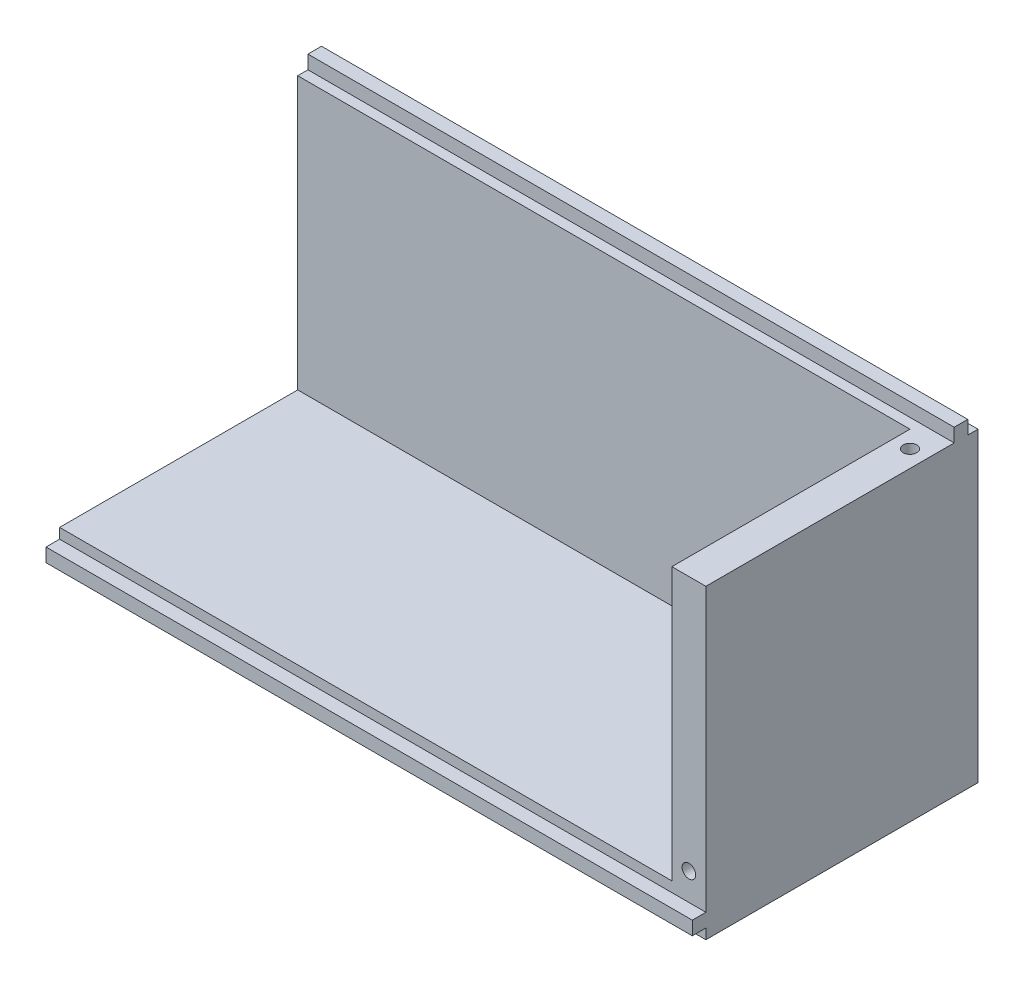
ISO-10303-21;
HEADER;
FILE_DESCRIPTION(('STEP AP214'),'2;1');
FILE_NAME('part.step','',(''),(''),'','','');
FILE_SCHEMA(('AUTOMOTIVE_DESIGN { 1 0 10303 214 1 1 1 1 }'));
ENDSEC;
DATA;
#1=APPLICATION_CONTEXT('core data for automotive mechanical design processes');
#2=APPLICATION_PROTOCOL_DEFINITION('international standard','automotive_design',2000,#1);
#3=PRODUCT_CONTEXT('',#1,'mechanical');
#4=PRODUCT('Part','Part','',(#3));
#5=PRODUCT_RELATED_PRODUCT_CATEGORY('part','',(#4));
#6=PRODUCT_DEFINITION_FORMATION('','',#4);
#7=PRODUCT_DEFINITION_CONTEXT('part definition',#1,'design');
#8=PRODUCT_DEFINITION('design','',#6,#7);
#9=PRODUCT_DEFINITION_SHAPE('','',#8);
#10=(LENGTH_UNIT() NAMED_UNIT(*) SI_UNIT(.MILLI.,.METRE.));
#11=(NAMED_UNIT(*) PLANE_ANGLE_UNIT() SI_UNIT($,.RADIAN.));
#12=(NAMED_UNIT(*) SI_UNIT($,.STERADIAN.) SOLID_ANGLE_UNIT());
#13=UNCERTAINTY_MEASURE_WITH_UNIT(LENGTH_MEASURE(1.E-05),#10,'distance_accuracy_value','');
#14=(GEOMETRIC_REPRESENTATION_CONTEXT(3) GLOBAL_UNCERTAINTY_ASSIGNED_CONTEXT((#13)) GLOBAL_UNIT_ASSIGNED_CONTEXT((#10,
#11,#12)) REPRESENTATION_CONTEXT('',''));
#15=CARTESIAN_POINT('',(0.,0.,0.));
#16=DIRECTION('',(0.,0.,1.));
#17=DIRECTION('',(1.,0.,0.));
#18=AXIS2_PLACEMENT_3D('',#15,#16,#17);
#19=CARTESIAN_POINT('',(0.,5.,0.));
#20=DIRECTION('',(0.,0.,-1.));
#21=DIRECTION('',(-1.,0.,0.));
#22=AXIS2_PLACEMENT_3D('',#19,#20,#21);
#23=PLANE('',#22);
#24=CARTESIAN_POINT('',(92.5,7.5,0.));
#25=DIRECTION('',(0.,0.,1.));
#26=DIRECTION('',(1.,0.,0.));
#27=AXIS2_PLACEMENT_3D('',#24,#25,#26);
#28=CIRCLE('',#27,0.999999999999987);
#29=CARTESIAN_POINT('',(93.5,7.5,0.));
#30=VERTEX_POINT('',#29);
#31=EDGE_CURVE('E167',#30,#30,#28,.T.);
#32=ORIENTED_EDGE('',*,*,#31,.F.);
#33=EDGE_LOOP('',(#32));
#34=FACE_BOUND('',#33,.T.);
#35=DIRECTION('',(-1.,0.,0.));
#36=VECTOR('',#35,1.);
#37=CARTESIAN_POINT('',(0.,3.5,0.));
#38=LINE('',#37,#36);
#39=CARTESIAN_POINT('',(95.,3.5,0.));
#40=VERTEX_POINT('',#39);
#41=CARTESIAN_POINT('',(0.,3.5,0.));
#42=VERTEX_POINT('',#41);
#43=EDGE_CURVE('E202',#40,#42,#38,.T.);
#44=ORIENTED_EDGE('',*,*,#43,.F.);
#45=DIRECTION('',(0.,-1.,0.));
#46=VECTOR('',#45,1.);
#47=CARTESIAN_POINT('',(95.,5.,0.));
#48=LINE('',#47,#46);
#49=CARTESIAN_POINT('',(95.,45.,0.));
#50=VERTEX_POINT('',#49);
#51=EDGE_CURVE('E338',#50,#40,#48,.T.);
#52=ORIENTED_EDGE('',*,*,#51,.F.);
#53=DIRECTION('',(1.,0.,0.));
#54=VECTOR('',#53,1.);
#55=CARTESIAN_POINT('',(90.,45.,0.));
#56=LINE('',#55,#54);
#57=CARTESIAN_POINT('',(90.,45.,0.));
#58=VERTEX_POINT('',#57);
#59=EDGE_CURVE('E279',#58,#50,#56,.T.);
#60=ORIENTED_EDGE('',*,*,#59,.F.);
#61=DIRECTION('',(0.,-1.,0.));
#62=VECTOR('',#61,1.);
#63=CARTESIAN_POINT('',(90.,45.,0.));
#64=LINE('',#63,#62);
#65=CARTESIAN_POINT('',(90.,5.,0.));
#66=VERTEX_POINT('',#65);
#67=EDGE_CURVE('E291',#58,#66,#64,.T.);
#68=ORIENTED_EDGE('',*,*,#67,.T.);
#69=DIRECTION('',(1.,0.,0.));
#70=VECTOR('',#69,1.);
#71=CARTESIAN_POINT('',(0.,5.,0.));
#72=LINE('',#71,#70);
#73=CARTESIAN_POINT('',(0.,5.,0.));
#74=VERTEX_POINT('',#73);
#75=EDGE_CURVE('E314',#74,#66,#72,.T.);
#76=ORIENTED_EDGE('',*,*,#75,.F.);
#77=DIRECTION('',(0.,-1.,0.));
#78=VECTOR('',#77,1.);
#79=CARTESIAN_POINT('',(0.,5.,0.));
#80=LINE('',#79,#78);
#81=EDGE_CURVE('E11',#74,#42,#80,.T.);
#82=ORIENTED_EDGE('',*,*,#81,.T.);
#83=EDGE_LOOP('',(#44,#52,#60,#68,#76,#82));
#84=FACE_BOUND('',#83,.T.);
#85=ADVANCED_FACE('F39',(#34,#84),#23,.F.);
#86=DIRECTION('',(1.,0.,0.));
#87=VECTOR('',#86,1.);
#88=CARTESIAN_POINT('',(0.,1.5,0.));
#89=LINE('',#88,#87);
#90=CARTESIAN_POINT('',(0.,1.5,0.));
#91=VERTEX_POINT('',#90);
#92=CARTESIAN_POINT('',(95.,1.5,0.));
#93=VERTEX_POINT('',#92);
#94=EDGE_CURVE('E55',#91,#93,#89,.T.);
#95=ORIENTED_EDGE('',*,*,#94,.F.);
#96=CARTESIAN_POINT('',(0.,0.,0.));
#97=VERTEX_POINT('',#96);
#98=EDGE_CURVE('E48',#91,#97,#80,.T.);
#99=ORIENTED_EDGE('',*,*,#98,.T.);
#100=DIRECTION('',(1.,0.,0.));
#101=VECTOR('',#100,1.);
#102=CARTESIAN_POINT('',(0.,0.,0.));
#103=LINE('',#102,#101);
#104=CARTESIAN_POINT('',(95.,0.,0.));
#105=VERTEX_POINT('',#104);
#106=EDGE_CURVE('E322',#97,#105,#103,.T.);
#107=ORIENTED_EDGE('',*,*,#106,.T.);
#108=EDGE_CURVE('E337',#93,#105,#48,.T.);
#109=ORIENTED_EDGE('',*,*,#108,.F.);
#110=EDGE_LOOP('',(#95,#99,#107,#109));
#111=FACE_BOUND('',#110,.T.);
#112=ADVANCED_FACE('F352',(#111),#23,.F.);
#113=CARTESIAN_POINT('',(0.,45.,0.));
#114=DIRECTION('',(0.,1.,0.));
#115=DIRECTION('',(0.,0.,1.));
#116=AXIS2_PLACEMENT_3D('',#113,#114,#115);
#117=PLANE('',#116);
#118=DIRECTION('',(-1.,0.,0.));
#119=VECTOR('',#118,1.);
#120=CARTESIAN_POINT('',(0.,45.,-38.5));
#121=LINE('',#120,#119);
#122=CARTESIAN_POINT('',(95.,45.,-38.5));
#123=VERTEX_POINT('',#122);
#124=CARTESIAN_POINT('',(0.,45.,-38.5));
#125=VERTEX_POINT('',#124);
#126=EDGE_CURVE('E237',#123,#125,#121,.T.);
#127=ORIENTED_EDGE('',*,*,#126,.F.);
#128=DIRECTION('',(0.,0.,-1.));
#129=VECTOR('',#128,1.);
#130=CARTESIAN_POINT('',(95.,45.,0.));
#131=LINE('',#130,#129);
#132=CARTESIAN_POINT('',(95.,45.,-40.));
#133=VERTEX_POINT('',#132);
#134=EDGE_CURVE('E283',#123,#133,#131,.T.);
#135=ORIENTED_EDGE('',*,*,#134,.T.);
#136=DIRECTION('',(-1.,0.,0.));
#137=VECTOR('',#136,1.);
#138=CARTESIAN_POINT('',(95.,45.,-40.));
#139=LINE('',#138,#137);
#140=CARTESIAN_POINT('',(0.,45.,-40.));
#141=VERTEX_POINT('',#140);
#142=EDGE_CURVE('E287',#133,#141,#139,.T.);
#143=ORIENTED_EDGE('',*,*,#142,.T.);
#144=DIRECTION('',(0.,0.,1.));
#145=VECTOR('',#144,1.);
#146=CARTESIAN_POINT('',(0.,45.,-40.));
#147=LINE('',#146,#145);
#148=EDGE_CURVE('E269',#141,#125,#147,.T.);
#149=ORIENTED_EDGE('',*,*,#148,.T.);
#150=EDGE_LOOP('',(#127,#135,#143,#149));
#151=FACE_BOUND('',#150,.T.);
#152=ADVANCED_FACE('F365',(#151),#117,.T.);
#153=CARTESIAN_POINT('',(0.,5.,0.));
#154=DIRECTION('',(0.,-1.,0.));
#155=DIRECTION('',(0.,0.,-1.));
#156=AXIS2_PLACEMENT_3D('',#153,#154,#155);
#157=PLANE('',#156);
#158=DIRECTION('',(0.,0.,1.));
#159=VECTOR('',#158,1.);
#160=CARTESIAN_POINT('',(90.,5.,-35.));
#161=LINE('',#160,#159);
#162=CARTESIAN_POINT('',(90.,5.,-35.));
#163=VERTEX_POINT('',#162);
#164=EDGE_CURVE('E295',#163,#66,#161,.T.);
#165=ORIENTED_EDGE('',*,*,#164,.F.);
#166=DIRECTION('',(1.,0.,0.));
#167=VECTOR('',#166,1.);
#168=CARTESIAN_POINT('',(0.,5.,-35.));
#169=LINE('',#168,#167);
#170=CARTESIAN_POINT('',(0.,5.,-35.));
#171=VERTEX_POINT('',#170);
#172=EDGE_CURVE('E268',#171,#163,#169,.T.);
#173=ORIENTED_EDGE('',*,*,#172,.F.);
#174=DIRECTION('',(0.,0.,1.));
#175=VECTOR('',#174,1.);
#176=CARTESIAN_POINT('',(0.,5.,0.));
#177=LINE('',#176,#175);
#178=EDGE_CURVE('E311',#171,#74,#177,.T.);
#179=ORIENTED_EDGE('',*,*,#178,.T.);
#180=ORIENTED_EDGE('',*,*,#75,.T.);
#181=EDGE_LOOP('',(#165,#173,#179,#180));
#182=FACE_BOUND('',#181,.T.);
#183=ADVANCED_FACE('F386',(#182),#157,.F.);
#184=CARTESIAN_POINT('',(0.,5.,0.));
#185=DIRECTION('',(1.,0.,0.));
#186=DIRECTION('',(0.,0.,-1.));
#187=AXIS2_PLACEMENT_3D('',#184,#185,#186);
#188=PLANE('',#187);
#189=CARTESIAN_POINT('',(0.,42.5,-37.5));
#190=DIRECTION('',(-1.,0.,0.));
#191=DIRECTION('',(0.,0.,1.));
#192=AXIS2_PLACEMENT_3D('',#189,#190,#191);
#193=CIRCLE('',#192,0.999999999999987);
#194=CARTESIAN_POINT('',(0.,42.5,-36.5));
#195=VERTEX_POINT('',#194);
#196=EDGE_CURVE('E181',#195,#195,#193,.T.);
#197=ORIENTED_EDGE('',*,*,#196,.F.);
#198=EDGE_LOOP('',(#197));
#199=FACE_BOUND('',#198,.T.);
#200=CARTESIAN_POINT('',(0.,2.5,-2.5));
#201=DIRECTION('',(-1.,0.,0.));
#202=DIRECTION('',(0.,0.,1.));
#203=AXIS2_PLACEMENT_3D('',#200,#201,#202);
#204=CIRCLE('',#203,0.999999999999989);
#205=CARTESIAN_POINT('',(0.,2.5,-1.50000000000001));
#206=VERTEX_POINT('',#205);
#207=EDGE_CURVE('E189',#206,#206,#204,.T.);
#208=ORIENTED_EDGE('',*,*,#207,.F.);
#209=EDGE_LOOP('',(#208));
#210=FACE_BOUND('',#209,.T.);
#211=DIRECTION('',(0.,0.,1.));
#212=VECTOR('',#211,1.);
#213=CARTESIAN_POINT('',(0.,0.,0.));
#214=LINE('',#213,#212);
#215=CARTESIAN_POINT('',(0.,0.,-40.));
#216=VERTEX_POINT('',#215);
#217=EDGE_CURVE('E310',#216,#97,#214,.T.);
#218=ORIENTED_EDGE('',*,*,#217,.T.);
#219=ORIENTED_EDGE('',*,*,#98,.F.);
#220=DIRECTION('',(0.,0.,-1.));
#221=VECTOR('',#220,1.);
#222=CARTESIAN_POINT('',(0.,1.5,2.));
#223=LINE('',#222,#221);
#224=CARTESIAN_POINT('',(0.,1.5,2.));
#225=VERTEX_POINT('',#224);
#226=EDGE_CURVE('E227',#225,#91,#223,.T.);
#227=ORIENTED_EDGE('',*,*,#226,.F.);
#228=DIRECTION('',(0.,-1.,0.));
#229=VECTOR('',#228,1.);
#230=CARTESIAN_POINT('',(0.,1.5,2.));
#231=LINE('',#230,#229);
#232=CARTESIAN_POINT('',(0.,3.5,2.));
#233=VERTEX_POINT('',#232);
#234=EDGE_CURVE('E197',#233,#225,#231,.T.);
#235=ORIENTED_EDGE('',*,*,#234,.F.);
#236=DIRECTION('',(0.,0.,-1.));
#237=VECTOR('',#236,1.);
#238=CARTESIAN_POINT('',(0.,3.5,2.));
#239=LINE('',#238,#237);
#240=EDGE_CURVE('E211',#233,#42,#239,.T.);
#241=ORIENTED_EDGE('',*,*,#240,.T.);
#242=ORIENTED_EDGE('',*,*,#81,.F.);
#243=ORIENTED_EDGE('',*,*,#178,.F.);
#244=DIRECTION('',(0.,-1.,0.));
#245=VECTOR('',#244,1.);
#246=CARTESIAN_POINT('',(0.,45.,-35.));
#247=LINE('',#246,#245);
#248=CARTESIAN_POINT('',(0.,45.,-35.));
#249=VERTEX_POINT('',#248);
#250=EDGE_CURVE('E306',#249,#171,#247,.T.);
#251=ORIENTED_EDGE('',*,*,#250,.F.);
#252=CARTESIAN_POINT('',(0.,45.,-36.5));
#253=VERTEX_POINT('',#252);
#254=EDGE_CURVE('E273',#253,#249,#147,.T.);
#255=ORIENTED_EDGE('',*,*,#254,.F.);
#256=DIRECTION('',(0.,-1.,0.));
#257=VECTOR('',#256,1.);
#258=CARTESIAN_POINT('',(0.,47.,-36.5));
#259=LINE('',#258,#257);
#260=CARTESIAN_POINT('',(0.,47.,-36.5));
#261=VERTEX_POINT('',#260);
#262=EDGE_CURVE('E264',#261,#253,#259,.T.);
#263=ORIENTED_EDGE('',*,*,#262,.F.);
#264=DIRECTION('',(0.,0.,1.));
#265=VECTOR('',#264,1.);
#266=CARTESIAN_POINT('',(0.,47.,-36.5));
#267=LINE('',#266,#265);
#268=CARTESIAN_POINT('',(0.,47.,-38.5));
#269=VERTEX_POINT('',#268);
#270=EDGE_CURVE('E232',#269,#261,#267,.T.);
#271=ORIENTED_EDGE('',*,*,#270,.F.);
#272=DIRECTION('',(0.,-1.,0.));
#273=VECTOR('',#272,1.);
#274=CARTESIAN_POINT('',(0.,47.,-38.5));
#275=LINE('',#274,#273);
#276=EDGE_CURVE('E246',#269,#125,#275,.T.);
#277=ORIENTED_EDGE('',*,*,#276,.T.);
#278=ORIENTED_EDGE('',*,*,#148,.F.);
#279=DIRECTION('',(0.,-1.,0.));
#280=VECTOR('',#279,1.);
#281=CARTESIAN_POINT('',(0.,5.,-40.));
#282=LINE('',#281,#280);
#283=EDGE_CURVE('E318',#141,#216,#282,.T.);
#284=ORIENTED_EDGE('',*,*,#283,.T.);
#285=EDGE_LOOP('',(#218,#219,#227,#235,#241,#242,#243,#251,#255,#263,#271,#277,#278,#284));
#286=FACE_BOUND('',#285,.T.);
#287=ADVANCED_FACE('F41',(#199,#210,#286),#188,.F.);
#288=CARTESIAN_POINT('',(95.,5.,0.));
#289=DIRECTION('',(-1.,0.,0.));
#290=DIRECTION('',(0.,0.,1.));
#291=AXIS2_PLACEMENT_3D('',#288,#289,#290);
#292=PLANE('',#291);
#293=DIRECTION('',(0.,0.,-1.));
#294=VECTOR('',#293,1.);
#295=CARTESIAN_POINT('',(95.,0.,0.));
#296=LINE('',#295,#294);
#297=CARTESIAN_POINT('',(95.,0.,-40.));
#298=VERTEX_POINT('',#297);
#299=EDGE_CURVE('E326',#105,#298,#296,.T.);
#300=ORIENTED_EDGE('',*,*,#299,.T.);
#301=DIRECTION('',(0.,-1.,0.));
#302=VECTOR('',#301,1.);
#303=CARTESIAN_POINT('',(95.,5.,-40.));
#304=LINE('',#303,#302);
#305=EDGE_CURVE('E334',#133,#298,#304,.T.);
#306=ORIENTED_EDGE('',*,*,#305,.F.);
#307=ORIENTED_EDGE('',*,*,#134,.F.);
#308=DIRECTION('',(0.,-1.,0.));
#309=VECTOR('',#308,1.);
#310=CARTESIAN_POINT('',(95.,47.,-38.5));
#311=LINE('',#310,#309);
#312=CARTESIAN_POINT('',(95.,47.,-38.5));
#313=VERTEX_POINT('',#312);
#314=EDGE_CURVE('E256',#313,#123,#311,.T.);
#315=ORIENTED_EDGE('',*,*,#314,.F.);
#316=DIRECTION('',(0.,0.,-1.));
#317=VECTOR('',#316,1.);
#318=CARTESIAN_POINT('',(95.,47.,-36.5));
#319=LINE('',#318,#317);
#320=CARTESIAN_POINT('',(95.,47.,-36.5));
#321=VERTEX_POINT('',#320);
#322=EDGE_CURVE('E240',#321,#313,#319,.T.);
#323=ORIENTED_EDGE('',*,*,#322,.F.);
#324=DIRECTION('',(0.,-1.,0.));
#325=VECTOR('',#324,1.);
#326=CARTESIAN_POINT('',(95.,47.,-36.5));
#327=LINE('',#326,#325);
#328=CARTESIAN_POINT('',(95.,45.,-36.5));
#329=VERTEX_POINT('',#328);
#330=EDGE_CURVE('E260',#321,#329,#327,.T.);
#331=ORIENTED_EDGE('',*,*,#330,.T.);
#332=EDGE_CURVE('E284',#50,#329,#131,.T.);
#333=ORIENTED_EDGE('',*,*,#332,.F.);
#334=ORIENTED_EDGE('',*,*,#51,.T.);
#335=DIRECTION('',(0.,0.,-1.));
#336=VECTOR('',#335,1.);
#337=CARTESIAN_POINT('',(95.,3.5,2.));
#338=LINE('',#337,#336);
#339=CARTESIAN_POINT('',(95.,3.5,2.));
#340=VERTEX_POINT('',#339);
#341=EDGE_CURVE('E219',#340,#40,#338,.T.);
#342=ORIENTED_EDGE('',*,*,#341,.F.);
#343=DIRECTION('',(0.,1.,0.));
#344=VECTOR('',#343,1.);
#345=CARTESIAN_POINT('',(95.,1.5,2.));
#346=LINE('',#345,#344);
#347=CARTESIAN_POINT('',(95.,1.5,2.));
#348=VERTEX_POINT('',#347);
#349=EDGE_CURVE('E205',#348,#340,#346,.T.);
#350=ORIENTED_EDGE('',*,*,#349,.F.);
#351=DIRECTION('',(0.,0.,-1.));
#352=VECTOR('',#351,1.);
#353=CARTESIAN_POINT('',(95.,1.5,2.));
#354=LINE('',#353,#352);
#355=EDGE_CURVE('E223',#348,#93,#354,.T.);
#356=ORIENTED_EDGE('',*,*,#355,.T.);
#357=ORIENTED_EDGE('',*,*,#108,.T.);
#358=EDGE_LOOP('',(#300,#306,#307,#315,#323,#331,#333,#334,#342,#350,#356,#357));
#359=FACE_BOUND('',#358,.T.);
#360=ADVANCED_FACE('F346',(#359),#292,.F.);
#361=CARTESIAN_POINT('',(0.,5.,-40.));
#362=DIRECTION('',(0.,0.,1.));
#363=DIRECTION('',(1.,0.,0.));
#364=AXIS2_PLACEMENT_3D('',#361,#362,#363);
#365=PLANE('',#364);
#366=DIRECTION('',(-1.,0.,0.));
#367=VECTOR('',#366,1.);
#368=CARTESIAN_POINT('',(0.,0.,-40.));
#369=LINE('',#368,#367);
#370=EDGE_CURVE('E315',#298,#216,#369,.T.);
#371=ORIENTED_EDGE('',*,*,#370,.T.);
#372=ORIENTED_EDGE('',*,*,#283,.F.);
#373=ORIENTED_EDGE('',*,*,#142,.F.);
#374=ORIENTED_EDGE('',*,*,#305,.T.);
#375=EDGE_LOOP('',(#371,#372,#373,#374));
#376=FACE_BOUND('',#375,.T.);
#377=ADVANCED_FACE('F358',(#376),#365,.F.);
#378=CARTESIAN_POINT('',(0.,0.,0.));
#379=DIRECTION('',(0.,-1.,0.));
#380=DIRECTION('',(0.,0.,-1.));
#381=AXIS2_PLACEMENT_3D('',#378,#379,#380);
#382=PLANE('',#381);
#383=ORIENTED_EDGE('',*,*,#217,.F.);
#384=ORIENTED_EDGE('',*,*,#370,.F.);
#385=ORIENTED_EDGE('',*,*,#299,.F.);
#386=ORIENTED_EDGE('',*,*,#106,.F.);
#387=EDGE_LOOP('',(#383,#384,#385,#386));
#388=FACE_BOUND('',#387,.T.);
#389=ADVANCED_FACE('F356',(#388),#382,.T.);
#390=CARTESIAN_POINT('',(0.,45.,-35.));
#391=DIRECTION('',(0.,0.,-1.));
#392=DIRECTION('',(-1.,0.,0.));
#393=AXIS2_PLACEMENT_3D('',#390,#391,#392);
#394=PLANE('',#393);
#395=ORIENTED_EDGE('',*,*,#172,.T.);
#396=DIRECTION('',(0.,-1.,0.));
#397=VECTOR('',#396,1.);
#398=CARTESIAN_POINT('',(90.,45.,-35.));
#399=LINE('',#398,#397);
#400=CARTESIAN_POINT('',(90.,45.,-35.));
#401=VERTEX_POINT('',#400);
#402=EDGE_CURVE('E302',#401,#163,#399,.T.);
#403=ORIENTED_EDGE('',*,*,#402,.F.);
#404=DIRECTION('',(1.,0.,0.));
#405=VECTOR('',#404,1.);
#406=CARTESIAN_POINT('',(0.,45.,-35.));
#407=LINE('',#406,#405);
#408=EDGE_CURVE('E272',#249,#401,#407,.T.);
#409=ORIENTED_EDGE('',*,*,#408,.F.);
#410=ORIENTED_EDGE('',*,*,#250,.T.);
#411=EDGE_LOOP('',(#395,#403,#409,#410));
#412=FACE_BOUND('',#411,.T.);
#413=ADVANCED_FACE('F382',(#412),#394,.F.);
#414=CARTESIAN_POINT('',(90.,45.,-35.));
#415=DIRECTION('',(1.,0.,0.));
#416=DIRECTION('',(0.,0.,-1.));
#417=AXIS2_PLACEMENT_3D('',#414,#415,#416);
#418=PLANE('',#417);
#419=ORIENTED_EDGE('',*,*,#164,.T.);
#420=ORIENTED_EDGE('',*,*,#67,.F.);
#421=DIRECTION('',(0.,0.,1.));
#422=VECTOR('',#421,1.);
#423=CARTESIAN_POINT('',(90.,45.,-35.));
#424=LINE('',#423,#422);
#425=EDGE_CURVE('E276',#401,#58,#424,.T.);
#426=ORIENTED_EDGE('',*,*,#425,.F.);
#427=ORIENTED_EDGE('',*,*,#402,.T.);
#428=EDGE_LOOP('',(#419,#420,#426,#427));
#429=FACE_BOUND('',#428,.T.);
#430=ADVANCED_FACE('F390',(#429),#418,.F.);
#431=CARTESIAN_POINT('',(92.5,45.,-32.5));
#432=DIRECTION('',(0.,1.,0.));
#433=DIRECTION('',(0.,0.,1.));
#434=AXIS2_PLACEMENT_3D('',#431,#432,#433);
#435=CIRCLE('',#434,0.999999999999987);
#436=CARTESIAN_POINT('',(92.5,45.,-31.5));
#437=VERTEX_POINT('',#436);
#438=EDGE_CURVE('E168',#437,#437,#435,.T.);
#439=ORIENTED_EDGE('',*,*,#438,.F.);
#440=EDGE_LOOP('',(#439));
#441=FACE_BOUND('',#440,.T.);
#442=DIRECTION('',(1.,0.,0.));
#443=VECTOR('',#442,1.);
#444=CARTESIAN_POINT('',(0.,45.,-36.5));
#445=LINE('',#444,#443);
#446=EDGE_CURVE('E231',#253,#329,#445,.T.);
#447=ORIENTED_EDGE('',*,*,#446,.F.);
#448=ORIENTED_EDGE('',*,*,#254,.T.);
#449=ORIENTED_EDGE('',*,*,#408,.T.);
#450=ORIENTED_EDGE('',*,*,#425,.T.);
#451=ORIENTED_EDGE('',*,*,#59,.T.);
#452=ORIENTED_EDGE('',*,*,#332,.T.);
#453=EDGE_LOOP('',(#447,#448,#449,#450,#451,#452));
#454=FACE_BOUND('',#453,.T.);
#455=ADVANCED_FACE('F377',(#441,#454),#117,.T.);
#456=CARTESIAN_POINT('',(0.,47.,-36.5));
#457=DIRECTION('',(0.,0.,-1.));
#458=DIRECTION('',(-1.,0.,0.));
#459=AXIS2_PLACEMENT_3D('',#456,#457,#458);
#460=PLANE('',#459);
#461=ORIENTED_EDGE('',*,*,#446,.T.);
#462=ORIENTED_EDGE('',*,*,#330,.F.);
#463=DIRECTION('',(1.,0.,0.));
#464=VECTOR('',#463,1.);
#465=CARTESIAN_POINT('',(0.,47.,-36.5));
#466=LINE('',#465,#464);
#467=EDGE_CURVE('E236',#261,#321,#466,.T.);
#468=ORIENTED_EDGE('',*,*,#467,.F.);
#469=ORIENTED_EDGE('',*,*,#262,.T.);
#470=EDGE_LOOP('',(#461,#462,#468,#469));
#471=FACE_BOUND('',#470,.T.);
#472=ADVANCED_FACE('F393',(#471),#460,.F.);
#473=CARTESIAN_POINT('',(0.,47.,-38.5));
#474=DIRECTION('',(0.,0.,1.));
#475=DIRECTION('',(1.,0.,0.));
#476=AXIS2_PLACEMENT_3D('',#473,#474,#475);
#477=PLANE('',#476);
#478=ORIENTED_EDGE('',*,*,#126,.T.);
#479=ORIENTED_EDGE('',*,*,#276,.F.);
#480=DIRECTION('',(-1.,0.,0.));
#481=VECTOR('',#480,1.);
#482=CARTESIAN_POINT('',(0.,47.,-38.5));
#483=LINE('',#482,#481);
#484=EDGE_CURVE('E243',#313,#269,#483,.T.);
#485=ORIENTED_EDGE('',*,*,#484,.F.);
#486=ORIENTED_EDGE('',*,*,#314,.T.);
#487=EDGE_LOOP('',(#478,#479,#485,#486));
#488=FACE_BOUND('',#487,.T.);
#489=ADVANCED_FACE('F368',(#488),#477,.F.);
#490=CARTESIAN_POINT('',(0.,47.,0.));
#491=DIRECTION('',(0.,-1.,0.));
#492=DIRECTION('',(0.,0.,-1.));
#493=AXIS2_PLACEMENT_3D('',#490,#491,#492);
#494=PLANE('',#493);
#495=ORIENTED_EDGE('',*,*,#270,.T.);
#496=ORIENTED_EDGE('',*,*,#467,.T.);
#497=ORIENTED_EDGE('',*,*,#322,.T.);
#498=ORIENTED_EDGE('',*,*,#484,.T.);
#499=EDGE_LOOP('',(#495,#496,#497,#498));
#500=FACE_BOUND('',#499,.T.);
#501=ADVANCED_FACE('F395',(#500),#494,.F.);
#502=CARTESIAN_POINT('',(0.,1.5,2.));
#503=DIRECTION('',(0.,1.,0.));
#504=DIRECTION('',(0.,0.,1.));
#505=AXIS2_PLACEMENT_3D('',#502,#503,#504);
#506=PLANE('',#505);
#507=ORIENTED_EDGE('',*,*,#94,.T.);
#508=ORIENTED_EDGE('',*,*,#355,.F.);
#509=DIRECTION('',(1.,0.,0.));
#510=VECTOR('',#509,1.);
#511=CARTESIAN_POINT('',(0.,1.5,2.));
#512=LINE('',#511,#510);
#513=EDGE_CURVE('E201',#225,#348,#512,.T.);
#514=ORIENTED_EDGE('',*,*,#513,.F.);
#515=ORIENTED_EDGE('',*,*,#226,.T.);
#516=EDGE_LOOP('',(#507,#508,#514,#515));
#517=FACE_BOUND('',#516,.T.);
#518=ADVANCED_FACE('F397',(#517),#506,.F.);
#519=CARTESIAN_POINT('',(0.,3.5,2.));
#520=DIRECTION('',(0.,-1.,0.));
#521=DIRECTION('',(1.,0.,0.));
#522=AXIS2_PLACEMENT_3D('',#519,#520,#521);
#523=PLANE('',#522);
#524=ORIENTED_EDGE('',*,*,#43,.T.);
#525=ORIENTED_EDGE('',*,*,#240,.F.);
#526=DIRECTION('',(-1.,0.,0.));
#527=VECTOR('',#526,1.);
#528=CARTESIAN_POINT('',(0.,3.5,2.));
#529=LINE('',#528,#527);
#530=EDGE_CURVE('E208',#340,#233,#529,.T.);
#531=ORIENTED_EDGE('',*,*,#530,.F.);
#532=ORIENTED_EDGE('',*,*,#341,.T.);
#533=EDGE_LOOP('',(#524,#525,#531,#532));
#534=FACE_BOUND('',#533,.T.);
#535=ADVANCED_FACE('F403',(#534),#523,.F.);
#536=CARTESIAN_POINT('',(0.,0.,2.));
#537=DIRECTION('',(0.,0.,-1.));
#538=DIRECTION('',(-1.,0.,0.));
#539=AXIS2_PLACEMENT_3D('',#536,#537,#538);
#540=PLANE('',#539);
#541=ORIENTED_EDGE('',*,*,#234,.T.);
#542=ORIENTED_EDGE('',*,*,#513,.T.);
#543=ORIENTED_EDGE('',*,*,#349,.T.);
#544=ORIENTED_EDGE('',*,*,#530,.T.);
#545=EDGE_LOOP('',(#541,#542,#543,#544));
#546=FACE_BOUND('',#545,.T.);
#547=ADVANCED_FACE('F476',(#546),#540,.F.);
#548=CARTESIAN_POINT('',(10.,2.5,-2.50000000000001));
#549=DIRECTION('',(-1.,0.,0.));
#550=DIRECTION('',(0.,0.,1.));
#551=AXIS2_PLACEMENT_3D('',#548,#549,#550);
#552=CONICAL_SURFACE('',#551,0.999999999999993,1.02974425867665);
#553=CARTESIAN_POINT('',(10.6008606190276,2.5,-2.50000000000001));
#554=VERTEX_POINT('',#553);
#555=VERTEX_LOOP('',#554);
#556=FACE_BOUND('',#555,.T.);
#557=CARTESIAN_POINT('',(10.,2.5,-2.50000000000001));
#558=DIRECTION('',(-1.,0.,0.));
#559=DIRECTION('',(0.,0.,1.));
#560=AXIS2_PLACEMENT_3D('',#557,#558,#559);
#561=CIRCLE('',#560,0.999999999999993);
#562=CARTESIAN_POINT('',(10.,2.5,-1.50000000000002));
#563=VERTEX_POINT('',#562);
#564=EDGE_CURVE('E193',#563,#563,#561,.T.);
#565=ORIENTED_EDGE('',*,*,#564,.T.);
#566=EDGE_LOOP('',(#565));
#567=FACE_BOUND('',#566,.T.);
#568=ADVANCED_FACE('F486',(#556,#567),#552,.F.);
#569=CARTESIAN_POINT('',(0.,2.5,-2.5));
#570=DIRECTION('',(-1.,0.,0.));
#571=DIRECTION('',(0.,0.,1.));
#572=AXIS2_PLACEMENT_3D('',#569,#570,#571);
#573=CYLINDRICAL_SURFACE('',#572,0.999999999999991);
#574=ORIENTED_EDGE('',*,*,#564,.F.);
#575=EDGE_LOOP('',(#574));
#576=FACE_BOUND('',#575,.T.);
#577=ORIENTED_EDGE('',*,*,#207,.T.);
#578=EDGE_LOOP('',(#577));
#579=FACE_BOUND('',#578,.T.);
#580=ADVANCED_FACE('F504',(#576,#579),#573,.F.);
#581=CARTESIAN_POINT('',(9.99999999999998,42.5,-37.5));
#582=DIRECTION('',(-1.,0.,0.));
#583=DIRECTION('',(0.,0.,1.));
#584=AXIS2_PLACEMENT_3D('',#581,#582,#583);
#585=CONICAL_SURFACE('',#584,0.999999999999994,1.02974425867665);
#586=CARTESIAN_POINT('',(10.6008606190275,42.5,-37.5));
#587=VERTEX_POINT('',#586);
#588=VERTEX_LOOP('',#587);
#589=FACE_BOUND('',#588,.T.);
#590=CARTESIAN_POINT('',(9.99999999999998,42.5,-37.5));
#591=DIRECTION('',(-1.,0.,0.));
#592=DIRECTION('',(0.,0.,1.));
#593=AXIS2_PLACEMENT_3D('',#590,#591,#592);
#594=CIRCLE('',#593,0.999999999999994);
#595=CARTESIAN_POINT('',(9.99999999999998,42.5,-36.5));
#596=VERTEX_POINT('',#595);
#597=EDGE_CURVE('E185',#596,#596,#594,.T.);
#598=ORIENTED_EDGE('',*,*,#597,.T.);
#599=EDGE_LOOP('',(#598));
#600=FACE_BOUND('',#599,.T.);
#601=ADVANCED_FACE('F514',(#589,#600),#585,.F.);
#602=CARTESIAN_POINT('',(0.,42.5,-37.5));
#603=DIRECTION('',(-1.,0.,0.));
#604=DIRECTION('',(0.,0.,1.));
#605=AXIS2_PLACEMENT_3D('',#602,#603,#604);
#606=CYLINDRICAL_SURFACE('',#605,0.99999999999999);
#607=ORIENTED_EDGE('',*,*,#597,.F.);
#608=EDGE_LOOP('',(#607));
#609=FACE_BOUND('',#608,.T.);
#610=ORIENTED_EDGE('',*,*,#196,.T.);
#611=EDGE_LOOP('',(#610));
#612=FACE_BOUND('',#611,.T.);
#613=ADVANCED_FACE('F524',(#609,#612),#606,.F.);
#614=CARTESIAN_POINT('',(92.5,7.5,-9.99999999999999));
#615=DIRECTION('',(0.,0.,1.));
#616=DIRECTION('',(1.,0.,0.));
#617=AXIS2_PLACEMENT_3D('',#614,#615,#616);
#618=CONICAL_SURFACE('',#617,0.999999999999987,1.02974425867664);
#619=CARTESIAN_POINT('',(92.5,7.5,-10.6008606190276));
#620=VERTEX_POINT('',#619);
#621=VERTEX_LOOP('',#620);
#622=FACE_BOUND('',#621,.T.);
#623=CARTESIAN_POINT('',(92.5,7.5,-9.99999999999999));
#624=DIRECTION('',(0.,0.,1.));
#625=DIRECTION('',(1.,0.,0.));
#626=AXIS2_PLACEMENT_3D('',#623,#624,#625);
#627=CIRCLE('',#626,0.999999999999987);
#628=CARTESIAN_POINT('',(93.5,7.5,-9.99999999999999));
#629=VERTEX_POINT('',#628);
#630=EDGE_CURVE('E173',#629,#629,#627,.T.);
#631=ORIENTED_EDGE('',*,*,#630,.T.);
#632=EDGE_LOOP('',(#631));
#633=FACE_BOUND('',#632,.T.);
#634=ADVANCED_FACE('F533',(#622,#633),#618,.F.);
#635=CARTESIAN_POINT('',(92.5,7.5,0.));
#636=DIRECTION('',(0.,0.,1.));
#637=DIRECTION('',(1.,0.,0.));
#638=AXIS2_PLACEMENT_3D('',#635,#636,#637);
#639=CYLINDRICAL_SURFACE('',#638,0.999999999999987);
#640=ORIENTED_EDGE('',*,*,#630,.F.);
#641=EDGE_LOOP('',(#640));
#642=FACE_BOUND('',#641,.T.);
#643=ORIENTED_EDGE('',*,*,#31,.T.);
#644=EDGE_LOOP('',(#643));
#645=FACE_BOUND('',#644,.T.);
#646=ADVANCED_FACE('F160',(#642,#645),#639,.F.);
#647=CARTESIAN_POINT('',(92.5,35.,-32.5));
#648=DIRECTION('',(0.,1.,0.));
#649=DIRECTION('',(0.,0.,1.));
#650=AXIS2_PLACEMENT_3D('',#647,#648,#649);
#651=CONICAL_SURFACE('',#650,0.999999999999987,1.02974425867664);
#652=CARTESIAN_POINT('',(92.5,34.3991393809724,-32.5));
#653=VERTEX_POINT('',#652);
#654=VERTEX_LOOP('',#653);
#655=FACE_BOUND('',#654,.T.);
#656=CARTESIAN_POINT('',(92.5,35.,-32.5));
#657=DIRECTION('',(0.,1.,0.));
#658=DIRECTION('',(0.,0.,1.));
#659=AXIS2_PLACEMENT_3D('',#656,#657,#658);
#660=CIRCLE('',#659,0.999999999999987);
#661=CARTESIAN_POINT('',(92.5,35.,-31.5));
#662=VERTEX_POINT('',#661);
#663=EDGE_CURVE('E164',#662,#662,#660,.T.);
#664=ORIENTED_EDGE('',*,*,#663,.T.);
#665=EDGE_LOOP('',(#664));
#666=FACE_BOUND('',#665,.T.);
#667=ADVANCED_FACE('F156',(#655,#666),#651,.F.);
#668=CARTESIAN_POINT('',(92.5,45.,-32.5));
#669=DIRECTION('',(0.,1.,0.));
#670=DIRECTION('',(0.,0.,1.));
#671=AXIS2_PLACEMENT_3D('',#668,#669,#670);
#672=CYLINDRICAL_SURFACE('',#671,0.999999999999987);
#673=ORIENTED_EDGE('',*,*,#663,.F.);
#674=EDGE_LOOP('',(#673));
#675=FACE_BOUND('',#674,.T.);
#676=ORIENTED_EDGE('',*,*,#438,.T.);
#677=EDGE_LOOP('',(#676));
#678=FACE_BOUND('',#677,.T.);
#679=ADVANCED_FACE('F159',(#675,#678),#672,.F.);
#680=CLOSED_SHELL('',(#85,#112,#152,#183,#287,#360,#377,#389,#413,#430,#455,#472,#489,#501,#518,
#535,#547,#568,#580,#601,#613,#634,#646,#667,#679));
#681=MANIFOLD_SOLID_BREP('B2',#680);
#682=ADVANCED_BREP_SHAPE_REPRESENTATION('',(#18,#681),#14);
#683=SHAPE_DEFINITION_REPRESENTATION(#9,#682);
ENDSEC;
END-ISO-10303-21;
